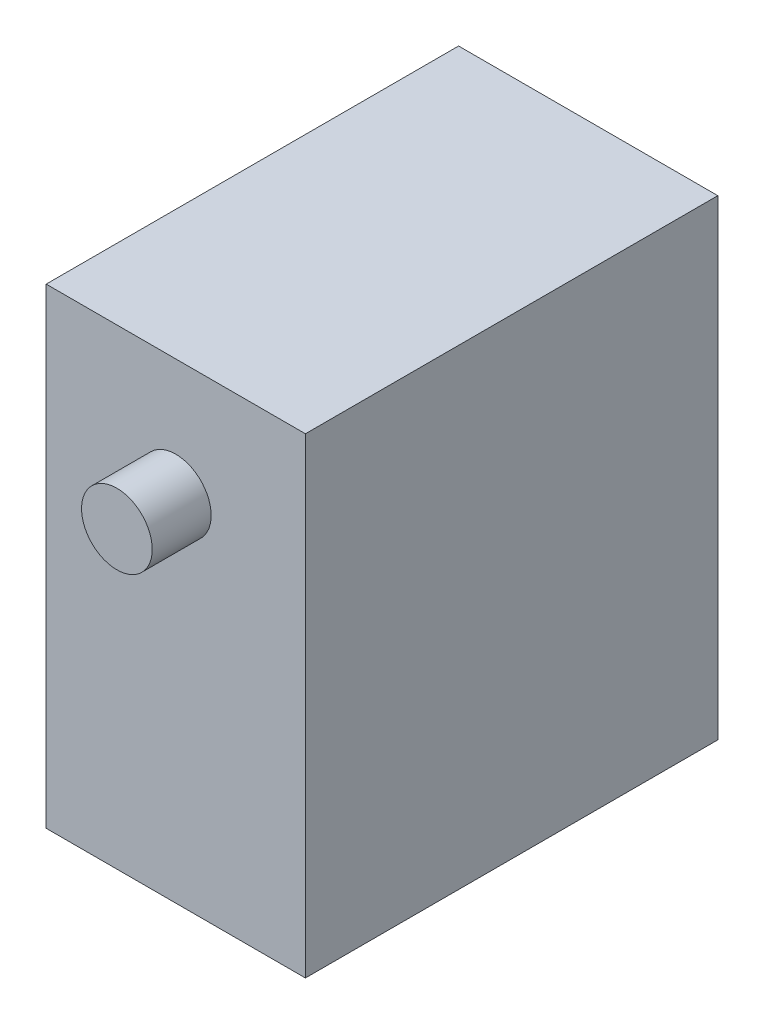
ISO-10303-21;
HEADER;
FILE_DESCRIPTION(('STEP AP214'),'2;1');
FILE_NAME('part.step','',(''),(''),'','','');
FILE_SCHEMA(('AUTOMOTIVE_DESIGN { 1 0 10303 214 1 1 1 1 }'));
ENDSEC;
DATA;
#1=APPLICATION_CONTEXT('core data for automotive mechanical design processes');
#2=APPLICATION_PROTOCOL_DEFINITION('international standard','automotive_design',2000,#1);
#3=PRODUCT_CONTEXT('',#1,'mechanical');
#4=PRODUCT('Part','Part','',(#3));
#5=PRODUCT_RELATED_PRODUCT_CATEGORY('part','',(#4));
#6=PRODUCT_DEFINITION_FORMATION('','',#4);
#7=PRODUCT_DEFINITION_CONTEXT('part definition',#1,'design');
#8=PRODUCT_DEFINITION('design','',#6,#7);
#9=PRODUCT_DEFINITION_SHAPE('','',#8);
#10=(LENGTH_UNIT() NAMED_UNIT(*) SI_UNIT(.MILLI.,.METRE.));
#11=(NAMED_UNIT(*) PLANE_ANGLE_UNIT() SI_UNIT($,.RADIAN.));
#12=(NAMED_UNIT(*) SI_UNIT($,.STERADIAN.) SOLID_ANGLE_UNIT());
#13=UNCERTAINTY_MEASURE_WITH_UNIT(LENGTH_MEASURE(1.E-05),#10,'distance_accuracy_value','');
#14=(GEOMETRIC_REPRESENTATION_CONTEXT(3) GLOBAL_UNCERTAINTY_ASSIGNED_CONTEXT((#13)) GLOBAL_UNIT_ASSIGNED_CONTEXT((#10,
#11,#12)) REPRESENTATION_CONTEXT('',''));
#15=CARTESIAN_POINT('',(0.,0.,0.));
#16=DIRECTION('',(0.,0.,1.));
#17=DIRECTION('',(1.,0.,0.));
#18=AXIS2_PLACEMENT_3D('',#15,#16,#17);
#19=CARTESIAN_POINT('',(0.,0.,35.));
#20=DIRECTION('',(0.,0.,1.));
#21=DIRECTION('',(1.,0.,0.));
#22=AXIS2_PLACEMENT_3D('',#19,#20,#21);
#23=PLANE('',#22);
#24=DIRECTION('',(0.,-1.,0.));
#25=VECTOR('',#24,1.);
#26=CARTESIAN_POINT('',(-11.,-20.,35.));
#27=LINE('',#26,#25);
#28=CARTESIAN_POINT('',(-11.,20.,35.));
#29=VERTEX_POINT('',#28);
#30=CARTESIAN_POINT('',(-11.,-20.,35.));
#31=VERTEX_POINT('',#30);
#32=EDGE_CURVE('E85',#29,#31,#27,.T.);
#33=ORIENTED_EDGE('',*,*,#32,.T.);
#34=DIRECTION('',(1.,0.,0.));
#35=VECTOR('',#34,1.);
#36=CARTESIAN_POINT('',(11.,-20.,35.));
#37=LINE('',#36,#35);
#38=CARTESIAN_POINT('',(11.,-20.,35.));
#39=VERTEX_POINT('',#38);
#40=EDGE_CURVE('E80',#31,#39,#37,.T.);
#41=ORIENTED_EDGE('',*,*,#40,.T.);
#42=DIRECTION('',(0.,1.,0.));
#43=VECTOR('',#42,1.);
#44=CARTESIAN_POINT('',(11.,-20.,35.));
#45=LINE('',#44,#43);
#46=CARTESIAN_POINT('',(11.,20.,35.));
#47=VERTEX_POINT('',#46);
#48=EDGE_CURVE('E83',#39,#47,#45,.T.);
#49=ORIENTED_EDGE('',*,*,#48,.T.);
#50=DIRECTION('',(-1.,0.,0.));
#51=VECTOR('',#50,1.);
#52=CARTESIAN_POINT('',(11.,20.,35.));
#53=LINE('',#52,#51);
#54=EDGE_CURVE('E50',#47,#29,#53,.T.);
#55=ORIENTED_EDGE('',*,*,#54,.T.);
#56=EDGE_LOOP('',(#33,#41,#49,#55));
#57=FACE_BOUND('',#56,.T.);
#58=CARTESIAN_POINT('',(0.,9.99999999999999,35.));
#59=DIRECTION('',(0.,0.,1.));
#60=DIRECTION('',(1.,0.,0.));
#61=AXIS2_PLACEMENT_3D('',#58,#59,#60);
#62=CIRCLE('',#61,3.);
#63=CARTESIAN_POINT('',(3.00000000000006,9.99999999999999,35.));
#64=VERTEX_POINT('',#63);
#65=EDGE_CURVE('E100',#64,#64,#62,.T.);
#66=ORIENTED_EDGE('',*,*,#65,.F.);
#67=EDGE_LOOP('',(#66));
#68=FACE_BOUND('',#67,.T.);
#69=ADVANCED_FACE('F33',(#57,#68),#23,.T.);
#70=CARTESIAN_POINT('',(0.,0.,0.));
#71=DIRECTION('',(0.,0.,1.));
#72=DIRECTION('',(1.,0.,0.));
#73=AXIS2_PLACEMENT_3D('',#70,#71,#72);
#74=PLANE('',#73);
#75=DIRECTION('',(0.,-1.,0.));
#76=VECTOR('',#75,1.);
#77=CARTESIAN_POINT('',(-11.,-20.,0.));
#78=LINE('',#77,#76);
#79=CARTESIAN_POINT('',(-11.,20.,0.));
#80=VERTEX_POINT('',#79);
#81=CARTESIAN_POINT('',(-11.,-20.,0.));
#82=VERTEX_POINT('',#81);
#83=EDGE_CURVE('E97',#80,#82,#78,.T.);
#84=ORIENTED_EDGE('',*,*,#83,.F.);
#85=DIRECTION('',(-1.,0.,0.));
#86=VECTOR('',#85,1.);
#87=CARTESIAN_POINT('',(11.,20.,0.));
#88=LINE('',#87,#86);
#89=CARTESIAN_POINT('',(11.,20.,0.));
#90=VERTEX_POINT('',#89);
#91=EDGE_CURVE('E73',#90,#80,#88,.T.);
#92=ORIENTED_EDGE('',*,*,#91,.F.);
#93=DIRECTION('',(0.,1.,0.));
#94=VECTOR('',#93,1.);
#95=CARTESIAN_POINT('',(11.,-20.,0.));
#96=LINE('',#95,#94);
#97=CARTESIAN_POINT('',(11.,-20.,0.));
#98=VERTEX_POINT('',#97);
#99=EDGE_CURVE('E67',#98,#90,#96,.T.);
#100=ORIENTED_EDGE('',*,*,#99,.F.);
#101=DIRECTION('',(1.,0.,0.));
#102=VECTOR('',#101,1.);
#103=CARTESIAN_POINT('',(11.,-20.,0.));
#104=LINE('',#103,#102);
#105=EDGE_CURVE('E89',#82,#98,#104,.T.);
#106=ORIENTED_EDGE('',*,*,#105,.F.);
#107=EDGE_LOOP('',(#84,#92,#100,#106));
#108=FACE_BOUND('',#107,.T.);
#109=ADVANCED_FACE('F108',(#108),#74,.F.);
#110=CARTESIAN_POINT('',(-11.,-20.,35.));
#111=DIRECTION('',(1.,0.,0.));
#112=DIRECTION('',(0.,0.,-1.));
#113=AXIS2_PLACEMENT_3D('',#110,#111,#112);
#114=PLANE('',#113);
#115=ORIENTED_EDGE('',*,*,#83,.T.);
#116=DIRECTION('',(0.,0.,-1.));
#117=VECTOR('',#116,1.);
#118=CARTESIAN_POINT('',(-11.,-20.,35.));
#119=LINE('',#118,#117);
#120=EDGE_CURVE('E11',#31,#82,#119,.T.);
#121=ORIENTED_EDGE('',*,*,#120,.F.);
#122=ORIENTED_EDGE('',*,*,#32,.F.);
#123=DIRECTION('',(0.,0.,-1.));
#124=VECTOR('',#123,1.);
#125=CARTESIAN_POINT('',(-11.,20.,35.));
#126=LINE('',#125,#124);
#127=EDGE_CURVE('E93',#29,#80,#126,.T.);
#128=ORIENTED_EDGE('',*,*,#127,.T.);
#129=EDGE_LOOP('',(#115,#121,#122,#128));
#130=FACE_BOUND('',#129,.T.);
#131=ADVANCED_FACE('F35',(#130),#114,.F.);
#132=CARTESIAN_POINT('',(11.,-20.,35.));
#133=DIRECTION('',(0.,1.,0.));
#134=DIRECTION('',(0.,0.,1.));
#135=AXIS2_PLACEMENT_3D('',#132,#133,#134);
#136=PLANE('',#135);
#137=ORIENTED_EDGE('',*,*,#105,.T.);
#138=DIRECTION('',(0.,0.,-1.));
#139=VECTOR('',#138,1.);
#140=CARTESIAN_POINT('',(11.,-20.,35.));
#141=LINE('',#140,#139);
#142=EDGE_CURVE('E42',#39,#98,#141,.T.);
#143=ORIENTED_EDGE('',*,*,#142,.F.);
#144=ORIENTED_EDGE('',*,*,#40,.F.);
#145=ORIENTED_EDGE('',*,*,#120,.T.);
#146=EDGE_LOOP('',(#137,#143,#144,#145));
#147=FACE_BOUND('',#146,.T.);
#148=ADVANCED_FACE('F88',(#147),#136,.F.);
#149=CARTESIAN_POINT('',(11.,-20.,35.));
#150=DIRECTION('',(-1.,0.,0.));
#151=DIRECTION('',(0.,0.,1.));
#152=AXIS2_PLACEMENT_3D('',#149,#150,#151);
#153=PLANE('',#152);
#154=ORIENTED_EDGE('',*,*,#99,.T.);
#155=DIRECTION('',(0.,0.,-1.));
#156=VECTOR('',#155,1.);
#157=CARTESIAN_POINT('',(11.,20.,35.));
#158=LINE('',#157,#156);
#159=EDGE_CURVE('E90',#47,#90,#158,.T.);
#160=ORIENTED_EDGE('',*,*,#159,.F.);
#161=ORIENTED_EDGE('',*,*,#48,.F.);
#162=ORIENTED_EDGE('',*,*,#142,.T.);
#163=EDGE_LOOP('',(#154,#160,#161,#162));
#164=FACE_BOUND('',#163,.T.);
#165=ADVANCED_FACE('F91',(#164),#153,.F.);
#166=CARTESIAN_POINT('',(11.,20.,35.));
#167=DIRECTION('',(0.,-1.,0.));
#168=DIRECTION('',(1.,0.,0.));
#169=AXIS2_PLACEMENT_3D('',#166,#167,#168);
#170=PLANE('',#169);
#171=ORIENTED_EDGE('',*,*,#91,.T.);
#172=ORIENTED_EDGE('',*,*,#127,.F.);
#173=ORIENTED_EDGE('',*,*,#54,.F.);
#174=ORIENTED_EDGE('',*,*,#159,.T.);
#175=EDGE_LOOP('',(#171,#172,#173,#174));
#176=FACE_BOUND('',#175,.T.);
#177=ADVANCED_FACE('F105',(#176),#170,.F.);
#178=CARTESIAN_POINT('',(0.,9.99999999999999,40.));
#179=DIRECTION('',(0.,0.,-1.));
#180=DIRECTION('',(-1.,0.,0.));
#181=AXIS2_PLACEMENT_3D('',#178,#179,#180);
#182=CYLINDRICAL_SURFACE('',#181,3.);
#183=ORIENTED_EDGE('',*,*,#65,.T.);
#184=EDGE_LOOP('',(#183));
#185=FACE_BOUND('',#184,.T.);
#186=CARTESIAN_POINT('',(0.,9.99999999999999,40.));
#187=DIRECTION('',(0.,0.,1.));
#188=DIRECTION('',(1.,0.,0.));
#189=AXIS2_PLACEMENT_3D('',#186,#187,#188);
#190=CIRCLE('',#189,3.);
#191=CARTESIAN_POINT('',(3.00000000000006,9.99999999999999,40.));
#192=VERTEX_POINT('',#191);
#193=EDGE_CURVE('E113',#192,#192,#190,.T.);
#194=ORIENTED_EDGE('',*,*,#193,.F.);
#195=EDGE_LOOP('',(#194));
#196=FACE_BOUND('',#195,.T.);
#197=ADVANCED_FACE('F119',(#185,#196),#182,.T.);
#198=CARTESIAN_POINT('',(0.,0.,40.));
#199=DIRECTION('',(0.,0.,1.));
#200=DIRECTION('',(1.,0.,0.));
#201=AXIS2_PLACEMENT_3D('',#198,#199,#200);
#202=PLANE('',#201);
#203=ORIENTED_EDGE('',*,*,#193,.T.);
#204=EDGE_LOOP('',(#203));
#205=FACE_BOUND('',#204,.T.);
#206=ADVANCED_FACE('F117',(#205),#202,.T.);
#207=CLOSED_SHELL('',(#69,#109,#131,#148,#165,#177,#197,#206));
#208=MANIFOLD_SOLID_BREP('B2',#207);
#209=ADVANCED_BREP_SHAPE_REPRESENTATION('',(#18,#208),#14);
#210=SHAPE_DEFINITION_REPRESENTATION(#9,#209);
ENDSEC;
END-ISO-10303-21;
